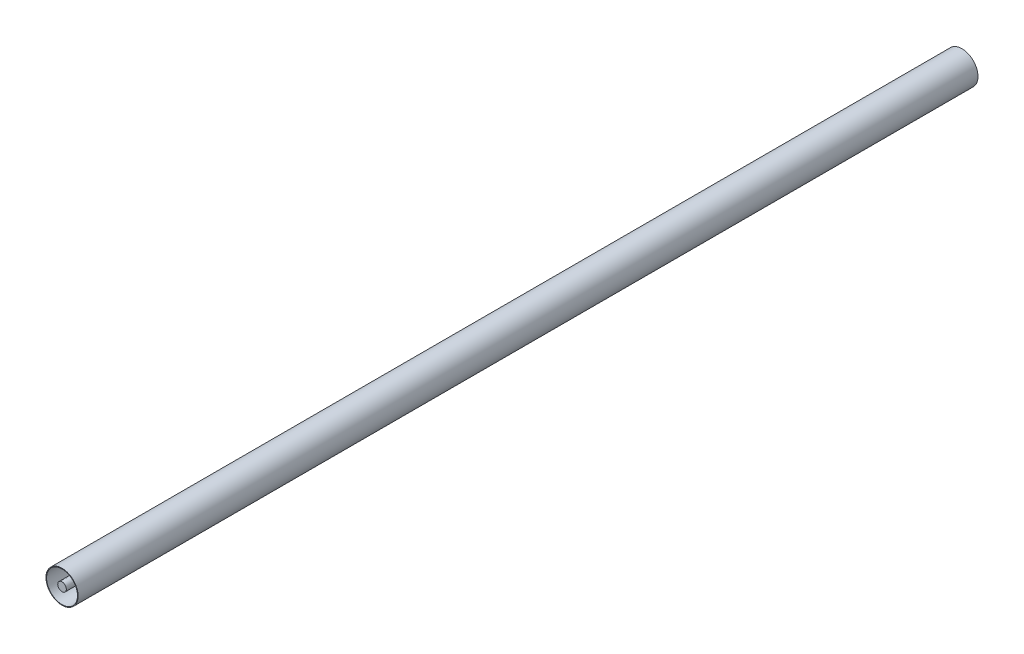
ISO-10303-21;
HEADER;
FILE_DESCRIPTION(('STEP AP214'),'2;1');
FILE_NAME('part.step','',(''),(''),'','','');
FILE_SCHEMA(('AUTOMOTIVE_DESIGN { 1 0 10303 214 1 1 1 1 }'));
ENDSEC;
DATA;
#1=APPLICATION_CONTEXT('core data for automotive mechanical design processes');
#2=APPLICATION_PROTOCOL_DEFINITION('international standard','automotive_design',2000,#1);
#3=PRODUCT_CONTEXT('',#1,'mechanical');
#4=PRODUCT('Part','Part','',(#3));
#5=PRODUCT_RELATED_PRODUCT_CATEGORY('part','',(#4));
#6=PRODUCT_DEFINITION_FORMATION('','',#4);
#7=PRODUCT_DEFINITION_CONTEXT('part definition',#1,'design');
#8=PRODUCT_DEFINITION('design','',#6,#7);
#9=PRODUCT_DEFINITION_SHAPE('','',#8);
#10=(LENGTH_UNIT() NAMED_UNIT(*) SI_UNIT(.MILLI.,.METRE.));
#11=(NAMED_UNIT(*) PLANE_ANGLE_UNIT() SI_UNIT($,.RADIAN.));
#12=(NAMED_UNIT(*) SI_UNIT($,.STERADIAN.) SOLID_ANGLE_UNIT());
#13=UNCERTAINTY_MEASURE_WITH_UNIT(LENGTH_MEASURE(1.E-05),#10,'distance_accuracy_value','');
#14=(GEOMETRIC_REPRESENTATION_CONTEXT(3) GLOBAL_UNCERTAINTY_ASSIGNED_CONTEXT((#13)) GLOBAL_UNIT_ASSIGNED_CONTEXT((#10,
#11,#12)) REPRESENTATION_CONTEXT('',''));
#15=CARTESIAN_POINT('',(0.,0.,0.));
#16=DIRECTION('',(0.,0.,1.));
#17=DIRECTION('',(1.,0.,0.));
#18=AXIS2_PLACEMENT_3D('',#15,#16,#17);
#19=CARTESIAN_POINT('',(0.,0.,0.));
#20=DIRECTION('',(0.,0.,1.));
#21=DIRECTION('',(1.,0.,0.));
#22=AXIS2_PLACEMENT_3D('',#19,#20,#21);
#23=CYLINDRICAL_SURFACE('',#22,17.8477555199189);
#24=CARTESIAN_POINT('',(0.,0.,0.));
#25=DIRECTION('',(0.,0.,1.));
#26=DIRECTION('',(1.,0.,0.));
#27=AXIS2_PLACEMENT_3D('',#24,#25,#26);
#28=CIRCLE('',#27,17.8477555199189);
#29=CARTESIAN_POINT('',(17.8477555199189,0.,0.));
#30=VERTEX_POINT('',#29);
#31=EDGE_CURVE('E11',#30,#30,#28,.T.);
#32=ORIENTED_EDGE('',*,*,#31,.T.);
#33=EDGE_LOOP('',(#32));
#34=FACE_BOUND('',#33,.T.);
#35=CARTESIAN_POINT('',(0.,0.,1000.));
#36=DIRECTION('',(0.,0.,1.));
#37=DIRECTION('',(1.,0.,0.));
#38=AXIS2_PLACEMENT_3D('',#35,#36,#37);
#39=CIRCLE('',#38,17.8477555199189);
#40=CARTESIAN_POINT('',(17.8477555199189,0.,1000.));
#41=VERTEX_POINT('',#40);
#42=EDGE_CURVE('E48',#41,#41,#39,.T.);
#43=ORIENTED_EDGE('',*,*,#42,.F.);
#44=EDGE_LOOP('',(#43));
#45=FACE_BOUND('',#44,.T.);
#46=ADVANCED_FACE('F45',(#34,#45),#23,.T.);
#47=CARTESIAN_POINT('',(0.,0.,0.));
#48=DIRECTION('',(0.,0.,1.));
#49=DIRECTION('',(1.,0.,0.));
#50=AXIS2_PLACEMENT_3D('',#47,#48,#49);
#51=PLANE('',#50);
#52=CARTESIAN_POINT('',(0.,0.,0.));
#53=DIRECTION('',(0.,0.,1.));
#54=DIRECTION('',(1.,0.,0.));
#55=AXIS2_PLACEMENT_3D('',#52,#53,#54);
#56=CIRCLE('',#55,17.1785);
#57=CARTESIAN_POINT('',(17.1785,0.,0.));
#58=VERTEX_POINT('',#57);
#59=EDGE_CURVE('E57',#58,#58,#56,.T.);
#60=ORIENTED_EDGE('',*,*,#59,.T.);
#61=EDGE_LOOP('',(#60));
#62=FACE_BOUND('',#61,.T.);
#63=ORIENTED_EDGE('',*,*,#31,.F.);
#64=EDGE_LOOP('',(#63));
#65=FACE_BOUND('',#64,.T.);
#66=ADVANCED_FACE('F67',(#62,#65),#51,.F.);
#67=CARTESIAN_POINT('',(0.,0.,1000.));
#68=DIRECTION('',(0.,0.,1.));
#69=DIRECTION('',(1.,0.,0.));
#70=AXIS2_PLACEMENT_3D('',#67,#68,#69);
#71=PLANE('',#70);
#72=CARTESIAN_POINT('',(0.,0.,1000.));
#73=DIRECTION('',(0.,0.,1.));
#74=DIRECTION('',(1.,0.,0.));
#75=AXIS2_PLACEMENT_3D('',#72,#73,#74);
#76=CIRCLE('',#75,17.1785);
#77=CARTESIAN_POINT('',(17.1785,0.,1000.));
#78=VERTEX_POINT('',#77);
#79=EDGE_CURVE('E59',#78,#78,#76,.T.);
#80=ORIENTED_EDGE('',*,*,#79,.F.);
#81=EDGE_LOOP('',(#80));
#82=FACE_BOUND('',#81,.T.);
#83=ORIENTED_EDGE('',*,*,#42,.T.);
#84=EDGE_LOOP('',(#83));
#85=FACE_BOUND('',#84,.T.);
#86=ADVANCED_FACE('F73',(#82,#85),#71,.T.);
#87=CARTESIAN_POINT('',(0.,0.,0.));
#88=DIRECTION('',(0.,0.,1.));
#89=DIRECTION('',(1.,0.,0.));
#90=AXIS2_PLACEMENT_3D('',#87,#88,#89);
#91=CYLINDRICAL_SURFACE('',#90,17.1785);
#92=ORIENTED_EDGE('',*,*,#59,.F.);
#93=EDGE_LOOP('',(#92));
#94=FACE_BOUND('',#93,.T.);
#95=ORIENTED_EDGE('',*,*,#79,.T.);
#96=EDGE_LOOP('',(#95));
#97=FACE_BOUND('',#96,.T.);
#98=ADVANCED_FACE('F70',(#94,#97),#91,.F.);
#99=CLOSED_SHELL('',(#46,#66,#86,#98));
#100=MANIFOLD_SOLID_BREP('B2',#99);
#101=CARTESIAN_POINT('',(0.,0.,1000.));
#102=DIRECTION('',(0.,0.,-1.));
#103=DIRECTION('',(-1.,0.,0.));
#104=AXIS2_PLACEMENT_3D('',#101,#102,#103);
#105=CYLINDRICAL_SURFACE('',#104,4.772);
#106=CARTESIAN_POINT('',(0.,0.,1000.));
#107=DIRECTION('',(0.,0.,1.));
#108=DIRECTION('',(1.,0.,0.));
#109=AXIS2_PLACEMENT_3D('',#106,#107,#108);
#110=CIRCLE('',#109,4.772);
#111=CARTESIAN_POINT('',(4.772,0.,1000.));
#112=VERTEX_POINT('',#111);
#113=EDGE_CURVE('E44',#112,#112,#110,.T.);
#114=ORIENTED_EDGE('',*,*,#113,.F.);
#115=EDGE_LOOP('',(#114));
#116=FACE_BOUND('',#115,.T.);
#117=CARTESIAN_POINT('',(0.,0.,0.));
#118=DIRECTION('',(0.,0.,1.));
#119=DIRECTION('',(1.,0.,0.));
#120=AXIS2_PLACEMENT_3D('',#117,#118,#119);
#121=CIRCLE('',#120,4.772);
#122=CARTESIAN_POINT('',(4.772,0.,0.));
#123=VERTEX_POINT('',#122);
#124=EDGE_CURVE('E114',#123,#123,#121,.T.);
#125=ORIENTED_EDGE('',*,*,#124,.T.);
#126=EDGE_LOOP('',(#125));
#127=FACE_BOUND('',#126,.T.);
#128=ADVANCED_FACE('F111',(#116,#127),#105,.T.);
#129=CARTESIAN_POINT('',(0.,0.,1000.));
#130=DIRECTION('',(0.,0.,1.));
#131=DIRECTION('',(1.,0.,0.));
#132=AXIS2_PLACEMENT_3D('',#129,#130,#131);
#133=PLANE('',#132);
#134=ORIENTED_EDGE('',*,*,#113,.T.);
#135=EDGE_LOOP('',(#134));
#136=FACE_BOUND('',#135,.T.);
#137=ADVANCED_FACE('F126',(#136),#133,.T.);
#138=CARTESIAN_POINT('',(0.,0.,0.));
#139=DIRECTION('',(0.,0.,1.));
#140=DIRECTION('',(1.,0.,0.));
#141=AXIS2_PLACEMENT_3D('',#138,#139,#140);
#142=PLANE('',#141);
#143=ORIENTED_EDGE('',*,*,#124,.F.);
#144=EDGE_LOOP('',(#143));
#145=FACE_BOUND('',#144,.T.);
#146=ADVANCED_FACE('F124',(#145),#142,.F.);
#147=CLOSED_SHELL('',(#128,#137,#146));
#148=MANIFOLD_SOLID_BREP('B6',#147);
#149=ADVANCED_BREP_SHAPE_REPRESENTATION('',(#18,#100,#148),#14);
#150=SHAPE_DEFINITION_REPRESENTATION(#9,#149);
ENDSEC;
END-ISO-10303-21;
